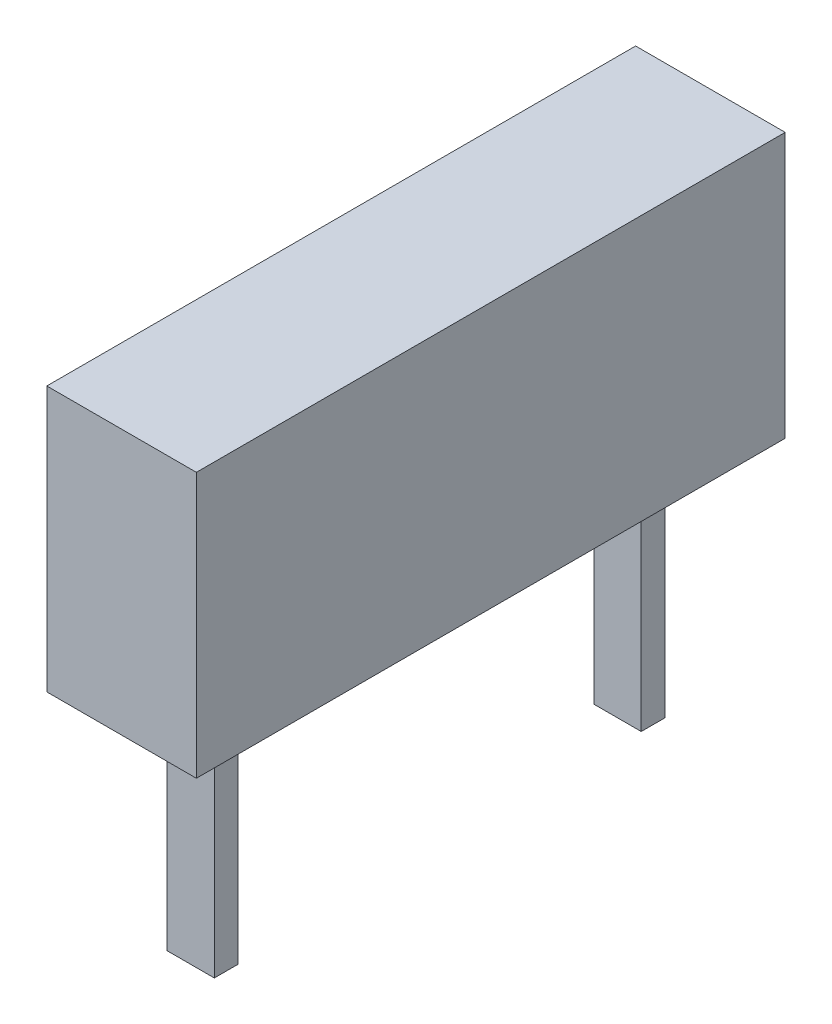
ISO-10303-21;
HEADER;
FILE_DESCRIPTION(('STEP AP214'),'2;1');
FILE_NAME('part.step','',(''),(''),'','','');
FILE_SCHEMA(('AUTOMOTIVE_DESIGN { 1 0 10303 214 1 1 1 1 }'));
ENDSEC;
DATA;
#1=APPLICATION_CONTEXT('core data for automotive mechanical design processes');
#2=APPLICATION_PROTOCOL_DEFINITION('international standard','automotive_design',2000,#1);
#3=PRODUCT_CONTEXT('',#1,'mechanical');
#4=PRODUCT('Part','Part','',(#3));
#5=PRODUCT_RELATED_PRODUCT_CATEGORY('part','',(#4));
#6=PRODUCT_DEFINITION_FORMATION('','',#4);
#7=PRODUCT_DEFINITION_CONTEXT('part definition',#1,'design');
#8=PRODUCT_DEFINITION('design','',#6,#7);
#9=PRODUCT_DEFINITION_SHAPE('','',#8);
#10=(LENGTH_UNIT() NAMED_UNIT(*) SI_UNIT(.MILLI.,.METRE.));
#11=(NAMED_UNIT(*) PLANE_ANGLE_UNIT() SI_UNIT($,.RADIAN.));
#12=(NAMED_UNIT(*) SI_UNIT($,.STERADIAN.) SOLID_ANGLE_UNIT());
#13=UNCERTAINTY_MEASURE_WITH_UNIT(LENGTH_MEASURE(1.E-05),#10,'distance_accuracy_value','');
#14=(GEOMETRIC_REPRESENTATION_CONTEXT(3) GLOBAL_UNCERTAINTY_ASSIGNED_CONTEXT((#13)) GLOBAL_UNIT_ASSIGNED_CONTEXT((#10,
#11,#12)) REPRESENTATION_CONTEXT('',''));
#15=CARTESIAN_POINT('',(0.,0.,0.));
#16=DIRECTION('',(0.,0.,1.));
#17=DIRECTION('',(1.,0.,0.));
#18=AXIS2_PLACEMENT_3D('',#15,#16,#17);
#19=CARTESIAN_POINT('',(-1.27,0.,5.));
#20=DIRECTION('',(0.,1.,0.));
#21=DIRECTION('',(0.,0.,1.));
#22=AXIS2_PLACEMENT_3D('',#19,#20,#21);
#23=PLANE('',#22);
#24=DIRECTION('',(0.,0.,1.));
#25=VECTOR('',#24,1.);
#26=CARTESIAN_POINT('',(0.399999999999999,0.,3.825));
#27=LINE('',#26,#25);
#28=CARTESIAN_POINT('',(0.399999999999999,0.,3.425));
#29=VERTEX_POINT('',#28);
#30=CARTESIAN_POINT('',(0.399999999999999,0.,3.825));
#31=VERTEX_POINT('',#30);
#32=EDGE_CURVE('E149',#29,#31,#27,.T.);
#33=ORIENTED_EDGE('',*,*,#32,.F.);
#34=DIRECTION('',(1.,0.,0.));
#35=VECTOR('',#34,1.);
#36=CARTESIAN_POINT('',(0.399999999999999,0.,3.425));
#37=LINE('',#36,#35);
#38=CARTESIAN_POINT('',(-0.399999999999999,0.,3.425));
#39=VERTEX_POINT('',#38);
#40=EDGE_CURVE('E158',#39,#29,#37,.T.);
#41=ORIENTED_EDGE('',*,*,#40,.F.);
#42=DIRECTION('',(0.,0.,-1.));
#43=VECTOR('',#42,1.);
#44=CARTESIAN_POINT('',(-0.400000000000001,0.,3.825));
#45=LINE('',#44,#43);
#46=CARTESIAN_POINT('',(-0.400000000000001,0.,3.825));
#47=VERTEX_POINT('',#46);
#48=EDGE_CURVE('E155',#47,#39,#45,.T.);
#49=ORIENTED_EDGE('',*,*,#48,.F.);
#50=DIRECTION('',(-1.,0.,0.));
#51=VECTOR('',#50,1.);
#52=CARTESIAN_POINT('',(0.399999999999999,0.,3.825));
#53=LINE('',#52,#51);
#54=EDGE_CURVE('E152',#31,#47,#53,.T.);
#55=ORIENTED_EDGE('',*,*,#54,.F.);
#56=EDGE_LOOP('',(#33,#41,#49,#55));
#57=FACE_BOUND('',#56,.T.);
#58=DIRECTION('',(0.,0.,1.));
#59=VECTOR('',#58,1.);
#60=CARTESIAN_POINT('',(-1.27,0.,-5.));
#61=LINE('',#60,#59);
#62=CARTESIAN_POINT('',(-1.27,0.,-5.));
#63=VERTEX_POINT('',#62);
#64=CARTESIAN_POINT('',(-1.27,0.,5.));
#65=VERTEX_POINT('',#64);
#66=EDGE_CURVE('E182',#63,#65,#61,.T.);
#67=ORIENTED_EDGE('',*,*,#66,.F.);
#68=DIRECTION('',(-1.,0.,0.));
#69=VECTOR('',#68,1.);
#70=CARTESIAN_POINT('',(-1.27,0.,-5.));
#71=LINE('',#70,#69);
#72=CARTESIAN_POINT('',(1.27,0.,-5.));
#73=VERTEX_POINT('',#72);
#74=EDGE_CURVE('E189',#73,#63,#71,.T.);
#75=ORIENTED_EDGE('',*,*,#74,.F.);
#76=DIRECTION('',(0.,0.,-1.));
#77=VECTOR('',#76,1.);
#78=CARTESIAN_POINT('',(1.27,0.,-5.));
#79=LINE('',#78,#77);
#80=CARTESIAN_POINT('',(1.27,0.,5.));
#81=VERTEX_POINT('',#80);
#82=EDGE_CURVE('E187',#81,#73,#79,.T.);
#83=ORIENTED_EDGE('',*,*,#82,.F.);
#84=DIRECTION('',(1.,0.,0.));
#85=VECTOR('',#84,1.);
#86=CARTESIAN_POINT('',(-1.27,0.,5.));
#87=LINE('',#86,#85);
#88=EDGE_CURVE('E185',#65,#81,#87,.T.);
#89=ORIENTED_EDGE('',*,*,#88,.F.);
#90=EDGE_LOOP('',(#67,#75,#83,#89));
#91=FACE_BOUND('',#90,.T.);
#92=DIRECTION('',(1.,0.,0.));
#93=VECTOR('',#92,1.);
#94=CARTESIAN_POINT('',(0.399999999999999,0.,-3.825));
#95=LINE('',#94,#93);
#96=CARTESIAN_POINT('',(-0.400000000000001,0.,-3.825));
#97=VERTEX_POINT('',#96);
#98=CARTESIAN_POINT('',(0.399999999999999,0.,-3.825));
#99=VERTEX_POINT('',#98);
#100=EDGE_CURVE('E117',#97,#99,#95,.T.);
#101=ORIENTED_EDGE('',*,*,#100,.F.);
#102=DIRECTION('',(0.,0.,-1.));
#103=VECTOR('',#102,1.);
#104=CARTESIAN_POINT('',(-0.400000000000001,0.,-3.825));
#105=LINE('',#104,#103);
#106=CARTESIAN_POINT('',(-0.400000000000001,0.,-3.425));
#107=VERTEX_POINT('',#106);
#108=EDGE_CURVE('E119',#107,#97,#105,.T.);
#109=ORIENTED_EDGE('',*,*,#108,.F.);
#110=DIRECTION('',(-1.,0.,0.));
#111=VECTOR('',#110,1.);
#112=CARTESIAN_POINT('',(0.399999999999999,0.,-3.425));
#113=LINE('',#112,#111);
#114=CARTESIAN_POINT('',(0.399999999999999,0.,-3.425));
#115=VERTEX_POINT('',#114);
#116=EDGE_CURVE('E52',#115,#107,#113,.T.);
#117=ORIENTED_EDGE('',*,*,#116,.F.);
#118=DIRECTION('',(0.,0.,1.));
#119=VECTOR('',#118,1.);
#120=CARTESIAN_POINT('',(0.399999999999999,0.,-3.825));
#121=LINE('',#120,#119);
#122=EDGE_CURVE('E47',#99,#115,#121,.T.);
#123=ORIENTED_EDGE('',*,*,#122,.F.);
#124=EDGE_LOOP('',(#101,#109,#117,#123));
#125=FACE_BOUND('',#124,.T.);
#126=ADVANCED_FACE('F32',(#57,#91,#125),#23,.F.);
#127=CARTESIAN_POINT('',(-1.27,4.5,-5.));
#128=DIRECTION('',(1.,0.,0.));
#129=DIRECTION('',(0.,0.,-1.));
#130=AXIS2_PLACEMENT_3D('',#127,#128,#129);
#131=PLANE('',#130);
#132=ORIENTED_EDGE('',*,*,#66,.T.);
#133=DIRECTION('',(0.,-1.,0.));
#134=VECTOR('',#133,1.);
#135=CARTESIAN_POINT('',(-1.27,4.5,5.));
#136=LINE('',#135,#134);
#137=CARTESIAN_POINT('',(-1.27,4.5,5.));
#138=VERTEX_POINT('',#137);
#139=EDGE_CURVE('E11',#138,#65,#136,.T.);
#140=ORIENTED_EDGE('',*,*,#139,.F.);
#141=DIRECTION('',(0.,0.,1.));
#142=VECTOR('',#141,1.);
#143=CARTESIAN_POINT('',(-1.27,4.5,-5.));
#144=LINE('',#143,#142);
#145=CARTESIAN_POINT('',(-1.27,4.5,-5.));
#146=VERTEX_POINT('',#145);
#147=EDGE_CURVE('E191',#146,#138,#144,.T.);
#148=ORIENTED_EDGE('',*,*,#147,.F.);
#149=DIRECTION('',(0.,-1.,0.));
#150=VECTOR('',#149,1.);
#151=CARTESIAN_POINT('',(-1.27,4.5,-5.));
#152=LINE('',#151,#150);
#153=EDGE_CURVE('E200',#146,#63,#152,.T.);
#154=ORIENTED_EDGE('',*,*,#153,.T.);
#155=EDGE_LOOP('',(#132,#140,#148,#154));
#156=FACE_BOUND('',#155,.T.);
#157=ADVANCED_FACE('F34',(#156),#131,.F.);
#158=CARTESIAN_POINT('',(-1.27,4.5,5.));
#159=DIRECTION('',(0.,0.,-1.));
#160=DIRECTION('',(-1.,0.,0.));
#161=AXIS2_PLACEMENT_3D('',#158,#159,#160);
#162=PLANE('',#161);
#163=ORIENTED_EDGE('',*,*,#88,.T.);
#164=DIRECTION('',(0.,-1.,0.));
#165=VECTOR('',#164,1.);
#166=CARTESIAN_POINT('',(1.27,4.5,5.));
#167=LINE('',#166,#165);
#168=CARTESIAN_POINT('',(1.27,4.5,5.));
#169=VERTEX_POINT('',#168);
#170=EDGE_CURVE('E40',#169,#81,#167,.T.);
#171=ORIENTED_EDGE('',*,*,#170,.F.);
#172=DIRECTION('',(1.,0.,0.));
#173=VECTOR('',#172,1.);
#174=CARTESIAN_POINT('',(-1.27,4.5,5.));
#175=LINE('',#174,#173);
#176=EDGE_CURVE('E194',#138,#169,#175,.T.);
#177=ORIENTED_EDGE('',*,*,#176,.F.);
#178=ORIENTED_EDGE('',*,*,#139,.T.);
#179=EDGE_LOOP('',(#163,#171,#177,#178));
#180=FACE_BOUND('',#179,.T.);
#181=ADVANCED_FACE('F225',(#180),#162,.F.);
#182=CARTESIAN_POINT('',(1.27,4.5,-5.));
#183=DIRECTION('',(-1.,0.,0.));
#184=DIRECTION('',(0.,0.,1.));
#185=AXIS2_PLACEMENT_3D('',#182,#183,#184);
#186=PLANE('',#185);
#187=ORIENTED_EDGE('',*,*,#82,.T.);
#188=DIRECTION('',(0.,-1.,0.));
#189=VECTOR('',#188,1.);
#190=CARTESIAN_POINT('',(1.27,4.5,-5.));
#191=LINE('',#190,#189);
#192=CARTESIAN_POINT('',(1.27,4.5,-5.));
#193=VERTEX_POINT('',#192);
#194=EDGE_CURVE('E203',#193,#73,#191,.T.);
#195=ORIENTED_EDGE('',*,*,#194,.F.);
#196=DIRECTION('',(0.,0.,-1.));
#197=VECTOR('',#196,1.);
#198=CARTESIAN_POINT('',(1.27,4.5,-5.));
#199=LINE('',#198,#197);
#200=EDGE_CURVE('E196',#169,#193,#199,.T.);
#201=ORIENTED_EDGE('',*,*,#200,.F.);
#202=ORIENTED_EDGE('',*,*,#170,.T.);
#203=EDGE_LOOP('',(#187,#195,#201,#202));
#204=FACE_BOUND('',#203,.T.);
#205=ADVANCED_FACE('F210',(#204),#186,.F.);
#206=CARTESIAN_POINT('',(-1.27,4.5,-5.));
#207=DIRECTION('',(0.,0.,1.));
#208=DIRECTION('',(1.,0.,0.));
#209=AXIS2_PLACEMENT_3D('',#206,#207,#208);
#210=PLANE('',#209);
#211=ORIENTED_EDGE('',*,*,#74,.T.);
#212=ORIENTED_EDGE('',*,*,#153,.F.);
#213=DIRECTION('',(-1.,0.,0.));
#214=VECTOR('',#213,1.);
#215=CARTESIAN_POINT('',(-1.27,4.5,-5.));
#216=LINE('',#215,#214);
#217=EDGE_CURVE('E198',#193,#146,#216,.T.);
#218=ORIENTED_EDGE('',*,*,#217,.F.);
#219=ORIENTED_EDGE('',*,*,#194,.T.);
#220=EDGE_LOOP('',(#211,#212,#218,#219));
#221=FACE_BOUND('',#220,.T.);
#222=ADVANCED_FACE('F218',(#221),#210,.F.);
#223=CARTESIAN_POINT('',(-1.27,4.5,5.));
#224=DIRECTION('',(0.,1.,0.));
#225=DIRECTION('',(0.,0.,1.));
#226=AXIS2_PLACEMENT_3D('',#223,#224,#225);
#227=PLANE('',#226);
#228=ORIENTED_EDGE('',*,*,#147,.T.);
#229=ORIENTED_EDGE('',*,*,#176,.T.);
#230=ORIENTED_EDGE('',*,*,#200,.T.);
#231=ORIENTED_EDGE('',*,*,#217,.T.);
#232=EDGE_LOOP('',(#228,#229,#230,#231));
#233=FACE_BOUND('',#232,.T.);
#234=ADVANCED_FACE('F224',(#233),#227,.T.);
#235=CARTESIAN_POINT('',(0.399999999999999,-3.96,3.825));
#236=DIRECTION('',(-1.,0.,0.));
#237=DIRECTION('',(0.,0.,1.));
#238=AXIS2_PLACEMENT_3D('',#235,#236,#237);
#239=PLANE('',#238);
#240=ORIENTED_EDGE('',*,*,#32,.T.);
#241=DIRECTION('',(0.,1.,0.));
#242=VECTOR('',#241,1.);
#243=CARTESIAN_POINT('',(0.399999999999999,-3.96,3.825));
#244=LINE('',#243,#242);
#245=CARTESIAN_POINT('',(0.399999999999999,-3.96,3.825));
#246=VERTEX_POINT('',#245);
#247=EDGE_CURVE('E179',#246,#31,#244,.T.);
#248=ORIENTED_EDGE('',*,*,#247,.F.);
#249=DIRECTION('',(0.,0.,1.));
#250=VECTOR('',#249,1.);
#251=CARTESIAN_POINT('',(0.399999999999999,-3.96,3.825));
#252=LINE('',#251,#250);
#253=CARTESIAN_POINT('',(0.399999999999999,-3.96,3.425));
#254=VERTEX_POINT('',#253);
#255=EDGE_CURVE('E161',#254,#246,#252,.T.);
#256=ORIENTED_EDGE('',*,*,#255,.F.);
#257=DIRECTION('',(0.,1.,0.));
#258=VECTOR('',#257,1.);
#259=CARTESIAN_POINT('',(0.399999999999999,-3.96,3.425));
#260=LINE('',#259,#258);
#261=EDGE_CURVE('E170',#254,#29,#260,.T.);
#262=ORIENTED_EDGE('',*,*,#261,.T.);
#263=EDGE_LOOP('',(#240,#248,#256,#262));
#264=FACE_BOUND('',#263,.T.);
#265=ADVANCED_FACE('F239',(#264),#239,.F.);
#266=CARTESIAN_POINT('',(0.399999999999999,-3.96,3.825));
#267=DIRECTION('',(0.,0.,-1.));
#268=DIRECTION('',(-1.,0.,0.));
#269=AXIS2_PLACEMENT_3D('',#266,#267,#268);
#270=PLANE('',#269);
#271=ORIENTED_EDGE('',*,*,#54,.T.);
#272=DIRECTION('',(0.,1.,0.));
#273=VECTOR('',#272,1.);
#274=CARTESIAN_POINT('',(-0.400000000000001,-3.96,3.825));
#275=LINE('',#274,#273);
#276=CARTESIAN_POINT('',(-0.400000000000001,-3.96,3.825));
#277=VERTEX_POINT('',#276);
#278=EDGE_CURVE('E176',#277,#47,#275,.T.);
#279=ORIENTED_EDGE('',*,*,#278,.F.);
#280=DIRECTION('',(-1.,0.,0.));
#281=VECTOR('',#280,1.);
#282=CARTESIAN_POINT('',(0.399999999999999,-3.96,3.825));
#283=LINE('',#282,#281);
#284=EDGE_CURVE('E164',#246,#277,#283,.T.);
#285=ORIENTED_EDGE('',*,*,#284,.F.);
#286=ORIENTED_EDGE('',*,*,#247,.T.);
#287=EDGE_LOOP('',(#271,#279,#285,#286));
#288=FACE_BOUND('',#287,.T.);
#289=ADVANCED_FACE('F258',(#288),#270,.F.);
#290=CARTESIAN_POINT('',(-0.400000000000001,-3.96,3.825));
#291=DIRECTION('',(1.,0.,0.));
#292=DIRECTION('',(0.,0.,-1.));
#293=AXIS2_PLACEMENT_3D('',#290,#291,#292);
#294=PLANE('',#293);
#295=ORIENTED_EDGE('',*,*,#48,.T.);
#296=DIRECTION('',(0.,1.,0.));
#297=VECTOR('',#296,1.);
#298=CARTESIAN_POINT('',(-0.399999999999999,-3.96,3.425));
#299=LINE('',#298,#297);
#300=CARTESIAN_POINT('',(-0.399999999999999,-3.96,3.425));
#301=VERTEX_POINT('',#300);
#302=EDGE_CURVE('E173',#301,#39,#299,.T.);
#303=ORIENTED_EDGE('',*,*,#302,.F.);
#304=DIRECTION('',(0.,0.,-1.));
#305=VECTOR('',#304,1.);
#306=CARTESIAN_POINT('',(-0.400000000000001,-3.96,3.825));
#307=LINE('',#306,#305);
#308=EDGE_CURVE('E166',#277,#301,#307,.T.);
#309=ORIENTED_EDGE('',*,*,#308,.F.);
#310=ORIENTED_EDGE('',*,*,#278,.T.);
#311=EDGE_LOOP('',(#295,#303,#309,#310));
#312=FACE_BOUND('',#311,.T.);
#313=ADVANCED_FACE('F265',(#312),#294,.F.);
#314=CARTESIAN_POINT('',(0.399999999999999,-3.96,3.425));
#315=DIRECTION('',(0.,0.,1.));
#316=DIRECTION('',(1.,0.,0.));
#317=AXIS2_PLACEMENT_3D('',#314,#315,#316);
#318=PLANE('',#317);
#319=ORIENTED_EDGE('',*,*,#40,.T.);
#320=ORIENTED_EDGE('',*,*,#261,.F.);
#321=DIRECTION('',(1.,0.,0.));
#322=VECTOR('',#321,1.);
#323=CARTESIAN_POINT('',(0.399999999999999,-3.96,3.425));
#324=LINE('',#323,#322);
#325=EDGE_CURVE('E168',#301,#254,#324,.T.);
#326=ORIENTED_EDGE('',*,*,#325,.F.);
#327=ORIENTED_EDGE('',*,*,#302,.T.);
#328=EDGE_LOOP('',(#319,#320,#326,#327));
#329=FACE_BOUND('',#328,.T.);
#330=ADVANCED_FACE('F272',(#329),#318,.F.);
#331=CARTESIAN_POINT('',(0.399999999999999,-3.96,3.425));
#332=DIRECTION('',(0.,1.,0.));
#333=DIRECTION('',(0.,0.,1.));
#334=AXIS2_PLACEMENT_3D('',#331,#332,#333);
#335=PLANE('',#334);
#336=ORIENTED_EDGE('',*,*,#255,.T.);
#337=ORIENTED_EDGE('',*,*,#284,.T.);
#338=ORIENTED_EDGE('',*,*,#308,.T.);
#339=ORIENTED_EDGE('',*,*,#325,.T.);
#340=EDGE_LOOP('',(#336,#337,#338,#339));
#341=FACE_BOUND('',#340,.T.);
#342=ADVANCED_FACE('F280',(#341),#335,.F.);
#343=CARTESIAN_POINT('',(0.399999999999999,-3.96,-3.825));
#344=DIRECTION('',(0.,0.,1.));
#345=DIRECTION('',(1.,0.,0.));
#346=AXIS2_PLACEMENT_3D('',#343,#344,#345);
#347=PLANE('',#346);
#348=ORIENTED_EDGE('',*,*,#100,.T.);
#349=DIRECTION('',(0.,1.,0.));
#350=VECTOR('',#349,1.);
#351=CARTESIAN_POINT('',(0.399999999999999,-3.96,-3.825));
#352=LINE('',#351,#350);
#353=CARTESIAN_POINT('',(0.399999999999999,-3.96,-3.825));
#354=VERTEX_POINT('',#353);
#355=EDGE_CURVE('E147',#354,#99,#352,.T.);
#356=ORIENTED_EDGE('',*,*,#355,.F.);
#357=DIRECTION('',(1.,0.,0.));
#358=VECTOR('',#357,1.);
#359=CARTESIAN_POINT('',(0.399999999999999,-3.96,-3.825));
#360=LINE('',#359,#358);
#361=CARTESIAN_POINT('',(-0.400000000000001,-3.96,-3.825));
#362=VERTEX_POINT('',#361);
#363=EDGE_CURVE('E133',#362,#354,#360,.T.);
#364=ORIENTED_EDGE('',*,*,#363,.F.);
#365=DIRECTION('',(0.,1.,0.));
#366=VECTOR('',#365,1.);
#367=CARTESIAN_POINT('',(-0.400000000000001,-3.96,-3.825));
#368=LINE('',#367,#366);
#369=EDGE_CURVE('E129',#362,#97,#368,.T.);
#370=ORIENTED_EDGE('',*,*,#369,.T.);
#371=EDGE_LOOP('',(#348,#356,#364,#370));
#372=FACE_BOUND('',#371,.T.);
#373=ADVANCED_FACE('F135',(#372),#347,.F.);
#374=CARTESIAN_POINT('',(0.399999999999999,-3.96,-3.825));
#375=DIRECTION('',(-1.,0.,0.));
#376=DIRECTION('',(0.,0.,1.));
#377=AXIS2_PLACEMENT_3D('',#374,#375,#376);
#378=PLANE('',#377);
#379=ORIENTED_EDGE('',*,*,#122,.T.);
#380=DIRECTION('',(0.,1.,0.));
#381=VECTOR('',#380,1.);
#382=CARTESIAN_POINT('',(0.399999999999999,-3.96,-3.425));
#383=LINE('',#382,#381);
#384=CARTESIAN_POINT('',(0.399999999999999,-3.96,-3.425));
#385=VERTEX_POINT('',#384);
#386=EDGE_CURVE('E139',#385,#115,#383,.T.);
#387=ORIENTED_EDGE('',*,*,#386,.F.);
#388=DIRECTION('',(0.,0.,1.));
#389=VECTOR('',#388,1.);
#390=CARTESIAN_POINT('',(0.399999999999999,-3.96,-3.825));
#391=LINE('',#390,#389);
#392=EDGE_CURVE('E369',#354,#385,#391,.T.);
#393=ORIENTED_EDGE('',*,*,#392,.F.);
#394=ORIENTED_EDGE('',*,*,#355,.T.);
#395=EDGE_LOOP('',(#379,#387,#393,#394));
#396=FACE_BOUND('',#395,.T.);
#397=ADVANCED_FACE('F295',(#396),#378,.F.);
#398=CARTESIAN_POINT('',(0.399999999999999,-3.96,-3.425));
#399=DIRECTION('',(0.,0.,-1.));
#400=DIRECTION('',(-1.,0.,0.));
#401=AXIS2_PLACEMENT_3D('',#398,#399,#400);
#402=PLANE('',#401);
#403=ORIENTED_EDGE('',*,*,#116,.T.);
#404=DIRECTION('',(0.,1.,0.));
#405=VECTOR('',#404,1.);
#406=CARTESIAN_POINT('',(-0.400000000000001,-3.96,-3.425));
#407=LINE('',#406,#405);
#408=CARTESIAN_POINT('',(-0.400000000000001,-3.96,-3.425));
#409=VERTEX_POINT('',#408);
#410=EDGE_CURVE('E132',#409,#107,#407,.T.);
#411=ORIENTED_EDGE('',*,*,#410,.F.);
#412=DIRECTION('',(-1.,0.,0.));
#413=VECTOR('',#412,1.);
#414=CARTESIAN_POINT('',(0.399999999999999,-3.96,-3.425));
#415=LINE('',#414,#413);
#416=EDGE_CURVE('E141',#385,#409,#415,.T.);
#417=ORIENTED_EDGE('',*,*,#416,.F.);
#418=ORIENTED_EDGE('',*,*,#386,.T.);
#419=EDGE_LOOP('',(#403,#411,#417,#418));
#420=FACE_BOUND('',#419,.T.);
#421=ADVANCED_FACE('F302',(#420),#402,.F.);
#422=CARTESIAN_POINT('',(-0.400000000000001,-3.96,-3.825));
#423=DIRECTION('',(1.,0.,0.));
#424=DIRECTION('',(0.,0.,-1.));
#425=AXIS2_PLACEMENT_3D('',#422,#423,#424);
#426=PLANE('',#425);
#427=ORIENTED_EDGE('',*,*,#108,.T.);
#428=ORIENTED_EDGE('',*,*,#369,.F.);
#429=DIRECTION('',(0.,0.,-1.));
#430=VECTOR('',#429,1.);
#431=CARTESIAN_POINT('',(-0.400000000000001,-3.96,-3.825));
#432=LINE('',#431,#430);
#433=EDGE_CURVE('E137',#409,#362,#432,.T.);
#434=ORIENTED_EDGE('',*,*,#433,.F.);
#435=ORIENTED_EDGE('',*,*,#410,.T.);
#436=EDGE_LOOP('',(#427,#428,#434,#435));
#437=FACE_BOUND('',#436,.T.);
#438=ADVANCED_FACE('F127',(#437),#426,.F.);
#439=CARTESIAN_POINT('',(-0.400000000000001,-3.96,-3.825));
#440=DIRECTION('',(0.,1.,0.));
#441=DIRECTION('',(0.,0.,1.));
#442=AXIS2_PLACEMENT_3D('',#439,#440,#441);
#443=PLANE('',#442);
#444=ORIENTED_EDGE('',*,*,#363,.T.);
#445=ORIENTED_EDGE('',*,*,#392,.T.);
#446=ORIENTED_EDGE('',*,*,#416,.T.);
#447=ORIENTED_EDGE('',*,*,#433,.T.);
#448=EDGE_LOOP('',(#444,#445,#446,#447));
#449=FACE_BOUND('',#448,.T.);
#450=ADVANCED_FACE('F317',(#449),#443,.F.);
#451=CLOSED_SHELL('',(#126,#157,#181,#205,#222,#234,#265,#289,#313,#330,#342,#373,#397,#421,
#438,#450));
#452=MANIFOLD_SOLID_BREP('B2',#451);
#453=ADVANCED_BREP_SHAPE_REPRESENTATION('',(#18,#452),#14);
#454=SHAPE_DEFINITION_REPRESENTATION(#9,#453);
ENDSEC;
END-ISO-10303-21;
